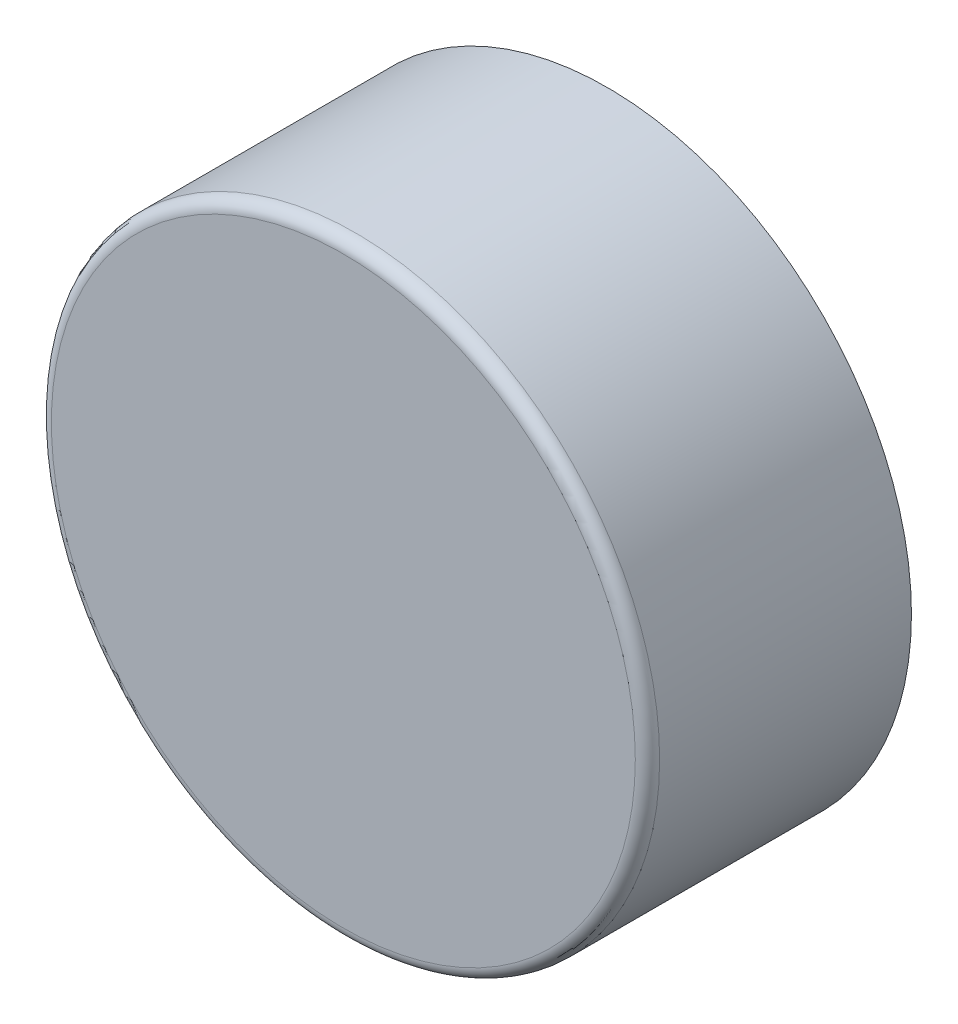
ISO-10303-21;
HEADER;
FILE_DESCRIPTION(('STEP AP214'),'2;1');
FILE_NAME('part.step','',(''),(''),'','','');
FILE_SCHEMA(('AUTOMOTIVE_DESIGN { 1 0 10303 214 1 1 1 1 }'));
ENDSEC;
DATA;
#1=APPLICATION_CONTEXT('core data for automotive mechanical design processes');
#2=APPLICATION_PROTOCOL_DEFINITION('international standard','automotive_design',2000,#1);
#3=PRODUCT_CONTEXT('',#1,'mechanical');
#4=PRODUCT('Part','Part','',(#3));
#5=PRODUCT_RELATED_PRODUCT_CATEGORY('part','',(#4));
#6=PRODUCT_DEFINITION_FORMATION('','',#4);
#7=PRODUCT_DEFINITION_CONTEXT('part definition',#1,'design');
#8=PRODUCT_DEFINITION('design','',#6,#7);
#9=PRODUCT_DEFINITION_SHAPE('','',#8);
#10=(LENGTH_UNIT() NAMED_UNIT(*) SI_UNIT(.MILLI.,.METRE.));
#11=(NAMED_UNIT(*) PLANE_ANGLE_UNIT() SI_UNIT($,.RADIAN.));
#12=(NAMED_UNIT(*) SI_UNIT($,.STERADIAN.) SOLID_ANGLE_UNIT());
#13=UNCERTAINTY_MEASURE_WITH_UNIT(LENGTH_MEASURE(1.E-05),#10,'distance_accuracy_value','');
#14=(GEOMETRIC_REPRESENTATION_CONTEXT(3) GLOBAL_UNCERTAINTY_ASSIGNED_CONTEXT((#13)) GLOBAL_UNIT_ASSIGNED_CONTEXT((#10,
#11,#12)) REPRESENTATION_CONTEXT('',''));
#15=CARTESIAN_POINT('',(0.,0.,0.));
#16=DIRECTION('',(0.,0.,1.));
#17=DIRECTION('',(1.,0.,0.));
#18=AXIS2_PLACEMENT_3D('',#15,#16,#17);
#19=CARTESIAN_POINT('',(0.,0.,9.24106781186547));
#20=DIRECTION('',(0.,0.,-1.));
#21=DIRECTION('',(-1.,0.,0.));
#22=AXIS2_PLACEMENT_3D('',#19,#20,#21);
#23=CYLINDRICAL_SURFACE('',#22,2.5);
#24=CARTESIAN_POINT('',(0.,0.,2.07));
#25=DIRECTION('',(0.,0.,1.));
#26=DIRECTION('',(1.,0.,0.));
#27=AXIS2_PLACEMENT_3D('',#24,#25,#26);
#28=CIRCLE('',#27,2.5);
#29=CARTESIAN_POINT('',(2.5,0.,2.07));
#30=VERTEX_POINT('',#29);
#31=EDGE_CURVE('E10',#30,#30,#28,.F.);
#32=ORIENTED_EDGE('',*,*,#31,.T.);
#33=EDGE_LOOP('',(#32));
#34=FACE_BOUND('',#33,.T.);
#35=CARTESIAN_POINT('',(0.,0.,0.));
#36=DIRECTION('',(0.,0.,1.));
#37=DIRECTION('',(1.,0.,0.));
#38=AXIS2_PLACEMENT_3D('',#35,#36,#37);
#39=CIRCLE('',#38,2.5);
#40=CARTESIAN_POINT('',(2.5,0.,0.));
#41=VERTEX_POINT('',#40);
#42=EDGE_CURVE('E49',#41,#41,#39,.T.);
#43=ORIENTED_EDGE('',*,*,#42,.T.);
#44=EDGE_LOOP('',(#43));
#45=FACE_BOUND('',#44,.T.);
#46=ADVANCED_FACE('F35',(#34,#45),#23,.T.);
#47=CARTESIAN_POINT('',(0.,0.,0.));
#48=DIRECTION('',(0.,0.,1.));
#49=DIRECTION('',(1.,0.,0.));
#50=AXIS2_PLACEMENT_3D('',#47,#48,#49);
#51=PLANE('',#50);
#52=ORIENTED_EDGE('',*,*,#42,.F.);
#53=EDGE_LOOP('',(#52));
#54=FACE_BOUND('',#53,.T.);
#55=ADVANCED_FACE('F57',(#54),#51,.F.);
#56=CARTESIAN_POINT('',(0.,0.,2.17));
#57=DIRECTION('',(0.,0.,1.));
#58=DIRECTION('',(0.,1.,0.));
#59=AXIS2_PLACEMENT_3D('',#56,#57,#58);
#60=PLANE('',#59);
#61=CARTESIAN_POINT('',(0.,0.,2.17));
#62=DIRECTION('',(0.,0.,1.));
#63=DIRECTION('',(1.,0.,0.));
#64=AXIS2_PLACEMENT_3D('',#61,#62,#63);
#65=CIRCLE('',#64,2.4);
#66=CARTESIAN_POINT('',(2.4,0.,2.17));
#67=VERTEX_POINT('',#66);
#68=EDGE_CURVE('E43',#67,#67,#65,.T.);
#69=ORIENTED_EDGE('',*,*,#68,.T.);
#70=EDGE_LOOP('',(#69));
#71=FACE_BOUND('',#70,.T.);
#72=ADVANCED_FACE('F59',(#71),#60,.T.);
#73=CARTESIAN_POINT('',(0.,0.,2.07));
#74=DIRECTION('',(0.,0.,1.));
#75=DIRECTION('',(1.,0.,0.));
#76=AXIS2_PLACEMENT_3D('',#73,#74,#75);
#77=TOROIDAL_SURFACE('',#76,2.4,0.1);
#78=ORIENTED_EDGE('',*,*,#31,.F.);
#79=EDGE_LOOP('',(#78));
#80=FACE_BOUND('',#79,.T.);
#81=ORIENTED_EDGE('',*,*,#68,.F.);
#82=EDGE_LOOP('',(#81));
#83=FACE_BOUND('',#82,.T.);
#84=ADVANCED_FACE('F37',(#80,#83),#77,.T.);
#85=CLOSED_SHELL('',(#46,#55,#72,#84));
#86=MANIFOLD_SOLID_BREP('B2',#85);
#87=ADVANCED_BREP_SHAPE_REPRESENTATION('',(#18,#86),#14);
#88=SHAPE_DEFINITION_REPRESENTATION(#9,#87);
ENDSEC;
END-ISO-10303-21;
